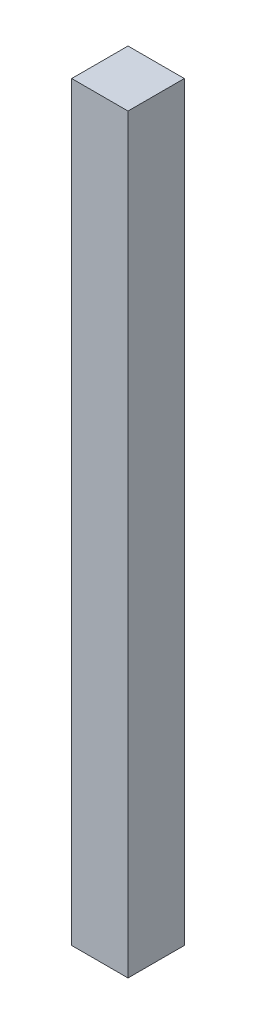
ISO-10303-21;
HEADER;
FILE_DESCRIPTION(('STEP AP214'),'2;1');
FILE_NAME('part.step','',(''),(''),'','','');
FILE_SCHEMA(('AUTOMOTIVE_DESIGN { 1 0 10303 214 1 1 1 1 }'));
ENDSEC;
DATA;
#1=APPLICATION_CONTEXT('core data for automotive mechanical design processes');
#2=APPLICATION_PROTOCOL_DEFINITION('international standard','automotive_design',2000,#1);
#3=PRODUCT_CONTEXT('',#1,'mechanical');
#4=PRODUCT('Part','Part','',(#3));
#5=PRODUCT_RELATED_PRODUCT_CATEGORY('part','',(#4));
#6=PRODUCT_DEFINITION_FORMATION('','',#4);
#7=PRODUCT_DEFINITION_CONTEXT('part definition',#1,'design');
#8=PRODUCT_DEFINITION('design','',#6,#7);
#9=PRODUCT_DEFINITION_SHAPE('','',#8);
#10=(LENGTH_UNIT() NAMED_UNIT(*) SI_UNIT(.MILLI.,.METRE.));
#11=(NAMED_UNIT(*) PLANE_ANGLE_UNIT() SI_UNIT($,.RADIAN.));
#12=(NAMED_UNIT(*) SI_UNIT($,.STERADIAN.) SOLID_ANGLE_UNIT());
#13=UNCERTAINTY_MEASURE_WITH_UNIT(LENGTH_MEASURE(1.E-05),#10,'distance_accuracy_value','');
#14=(GEOMETRIC_REPRESENTATION_CONTEXT(3) GLOBAL_UNCERTAINTY_ASSIGNED_CONTEXT((#13)) GLOBAL_UNIT_ASSIGNED_CONTEXT((#10,
#11,#12)) REPRESENTATION_CONTEXT('',''));
#15=CARTESIAN_POINT('',(0.,0.,0.));
#16=DIRECTION('',(0.,0.,1.));
#17=DIRECTION('',(1.,0.,0.));
#18=AXIS2_PLACEMENT_3D('',#15,#16,#17);
#19=CARTESIAN_POINT('',(15.,400.,15.));
#20=DIRECTION('',(-1.,0.,0.));
#21=DIRECTION('',(0.,0.,1.));
#22=AXIS2_PLACEMENT_3D('',#19,#20,#21);
#23=PLANE('',#22);
#24=DIRECTION('',(0.,0.,-1.));
#25=VECTOR('',#24,1.);
#26=CARTESIAN_POINT('',(15.,0.,15.));
#27=LINE('',#26,#25);
#28=CARTESIAN_POINT('',(15.,0.,15.));
#29=VERTEX_POINT('',#28);
#30=CARTESIAN_POINT('',(15.,0.,-15.));
#31=VERTEX_POINT('',#30);
#32=EDGE_CURVE('E96',#29,#31,#27,.T.);
#33=ORIENTED_EDGE('',*,*,#32,.T.);
#34=DIRECTION('',(0.,-1.,0.));
#35=VECTOR('',#34,1.);
#36=CARTESIAN_POINT('',(15.,400.,-15.));
#37=LINE('',#36,#35);
#38=CARTESIAN_POINT('',(15.,400.,-15.));
#39=VERTEX_POINT('',#38);
#40=EDGE_CURVE('E11',#39,#31,#37,.T.);
#41=ORIENTED_EDGE('',*,*,#40,.F.);
#42=DIRECTION('',(0.,0.,-1.));
#43=VECTOR('',#42,1.);
#44=CARTESIAN_POINT('',(15.,400.,15.));
#45=LINE('',#44,#43);
#46=CARTESIAN_POINT('',(15.,400.,15.));
#47=VERTEX_POINT('',#46);
#48=EDGE_CURVE('E84',#47,#39,#45,.T.);
#49=ORIENTED_EDGE('',*,*,#48,.F.);
#50=DIRECTION('',(0.,-1.,0.));
#51=VECTOR('',#50,1.);
#52=CARTESIAN_POINT('',(15.,400.,15.));
#53=LINE('',#52,#51);
#54=EDGE_CURVE('E92',#47,#29,#53,.T.);
#55=ORIENTED_EDGE('',*,*,#54,.T.);
#56=EDGE_LOOP('',(#33,#41,#49,#55));
#57=FACE_BOUND('',#56,.T.);
#58=ADVANCED_FACE('F33',(#57),#23,.F.);
#59=CARTESIAN_POINT('',(-15.,400.,-15.));
#60=DIRECTION('',(0.,0.,1.));
#61=DIRECTION('',(1.,0.,0.));
#62=AXIS2_PLACEMENT_3D('',#59,#60,#61);
#63=PLANE('',#62);
#64=DIRECTION('',(-1.,0.,0.));
#65=VECTOR('',#64,1.);
#66=CARTESIAN_POINT('',(-15.,0.,-15.));
#67=LINE('',#66,#65);
#68=CARTESIAN_POINT('',(-15.,0.,-15.));
#69=VERTEX_POINT('',#68);
#70=EDGE_CURVE('E88',#31,#69,#67,.T.);
#71=ORIENTED_EDGE('',*,*,#70,.T.);
#72=DIRECTION('',(0.,-1.,0.));
#73=VECTOR('',#72,1.);
#74=CARTESIAN_POINT('',(-15.,400.,-15.));
#75=LINE('',#74,#73);
#76=CARTESIAN_POINT('',(-15.,400.,-15.));
#77=VERTEX_POINT('',#76);
#78=EDGE_CURVE('E41',#77,#69,#75,.T.);
#79=ORIENTED_EDGE('',*,*,#78,.F.);
#80=DIRECTION('',(-1.,0.,0.));
#81=VECTOR('',#80,1.);
#82=CARTESIAN_POINT('',(-15.,400.,-15.));
#83=LINE('',#82,#81);
#84=EDGE_CURVE('E79',#39,#77,#83,.T.);
#85=ORIENTED_EDGE('',*,*,#84,.F.);
#86=ORIENTED_EDGE('',*,*,#40,.T.);
#87=EDGE_LOOP('',(#71,#79,#85,#86));
#88=FACE_BOUND('',#87,.T.);
#89=ADVANCED_FACE('F87',(#88),#63,.F.);
#90=CARTESIAN_POINT('',(-15.,400.,15.));
#91=DIRECTION('',(1.,0.,0.));
#92=DIRECTION('',(0.,0.,-1.));
#93=AXIS2_PLACEMENT_3D('',#90,#91,#92);
#94=PLANE('',#93);
#95=DIRECTION('',(0.,0.,1.));
#96=VECTOR('',#95,1.);
#97=CARTESIAN_POINT('',(-15.,0.,15.));
#98=LINE('',#97,#96);
#99=CARTESIAN_POINT('',(-15.,0.,15.));
#100=VERTEX_POINT('',#99);
#101=EDGE_CURVE('E66',#69,#100,#98,.T.);
#102=ORIENTED_EDGE('',*,*,#101,.T.);
#103=DIRECTION('',(0.,-1.,0.));
#104=VECTOR('',#103,1.);
#105=CARTESIAN_POINT('',(-15.,400.,15.));
#106=LINE('',#105,#104);
#107=CARTESIAN_POINT('',(-15.,400.,15.));
#108=VERTEX_POINT('',#107);
#109=EDGE_CURVE('E89',#108,#100,#106,.T.);
#110=ORIENTED_EDGE('',*,*,#109,.F.);
#111=DIRECTION('',(0.,0.,1.));
#112=VECTOR('',#111,1.);
#113=CARTESIAN_POINT('',(-15.,400.,15.));
#114=LINE('',#113,#112);
#115=EDGE_CURVE('E82',#77,#108,#114,.T.);
#116=ORIENTED_EDGE('',*,*,#115,.F.);
#117=ORIENTED_EDGE('',*,*,#78,.T.);
#118=EDGE_LOOP('',(#102,#110,#116,#117));
#119=FACE_BOUND('',#118,.T.);
#120=ADVANCED_FACE('F90',(#119),#94,.F.);
#121=CARTESIAN_POINT('',(-15.,400.,15.));
#122=DIRECTION('',(0.,0.,-1.));
#123=DIRECTION('',(-1.,0.,0.));
#124=AXIS2_PLACEMENT_3D('',#121,#122,#123);
#125=PLANE('',#124);
#126=DIRECTION('',(1.,0.,0.));
#127=VECTOR('',#126,1.);
#128=CARTESIAN_POINT('',(-15.,0.,15.));
#129=LINE('',#128,#127);
#130=EDGE_CURVE('E72',#100,#29,#129,.T.);
#131=ORIENTED_EDGE('',*,*,#130,.T.);
#132=ORIENTED_EDGE('',*,*,#54,.F.);
#133=DIRECTION('',(1.,0.,0.));
#134=VECTOR('',#133,1.);
#135=CARTESIAN_POINT('',(-15.,400.,15.));
#136=LINE('',#135,#134);
#137=EDGE_CURVE('E49',#108,#47,#136,.T.);
#138=ORIENTED_EDGE('',*,*,#137,.F.);
#139=ORIENTED_EDGE('',*,*,#109,.T.);
#140=EDGE_LOOP('',(#131,#132,#138,#139));
#141=FACE_BOUND('',#140,.T.);
#142=ADVANCED_FACE('F103',(#141),#125,.F.);
#143=CARTESIAN_POINT('',(0.,400.,0.));
#144=DIRECTION('',(0.,-1.,0.));
#145=DIRECTION('',(0.,0.,-1.));
#146=AXIS2_PLACEMENT_3D('',#143,#144,#145);
#147=PLANE('',#146);
#148=ORIENTED_EDGE('',*,*,#48,.T.);
#149=ORIENTED_EDGE('',*,*,#84,.T.);
#150=ORIENTED_EDGE('',*,*,#115,.T.);
#151=ORIENTED_EDGE('',*,*,#137,.T.);
#152=EDGE_LOOP('',(#148,#149,#150,#151));
#153=FACE_BOUND('',#152,.T.);
#154=ADVANCED_FACE('F80',(#153),#147,.F.);
#155=CARTESIAN_POINT('',(0.,0.,0.));
#156=DIRECTION('',(0.,-1.,0.));
#157=DIRECTION('',(0.,0.,-1.));
#158=AXIS2_PLACEMENT_3D('',#155,#156,#157);
#159=PLANE('',#158);
#160=ORIENTED_EDGE('',*,*,#32,.F.);
#161=ORIENTED_EDGE('',*,*,#130,.F.);
#162=ORIENTED_EDGE('',*,*,#101,.F.);
#163=ORIENTED_EDGE('',*,*,#70,.F.);
#164=EDGE_LOOP('',(#160,#161,#162,#163));
#165=FACE_BOUND('',#164,.T.);
#166=ADVANCED_FACE('F106',(#165),#159,.T.);
#167=CLOSED_SHELL('',(#58,#89,#120,#142,#154,#166));
#168=MANIFOLD_SOLID_BREP('B2',#167);
#169=ADVANCED_BREP_SHAPE_REPRESENTATION('',(#18,#168),#14);
#170=SHAPE_DEFINITION_REPRESENTATION(#9,#169);
ENDSEC;
END-ISO-10303-21;
